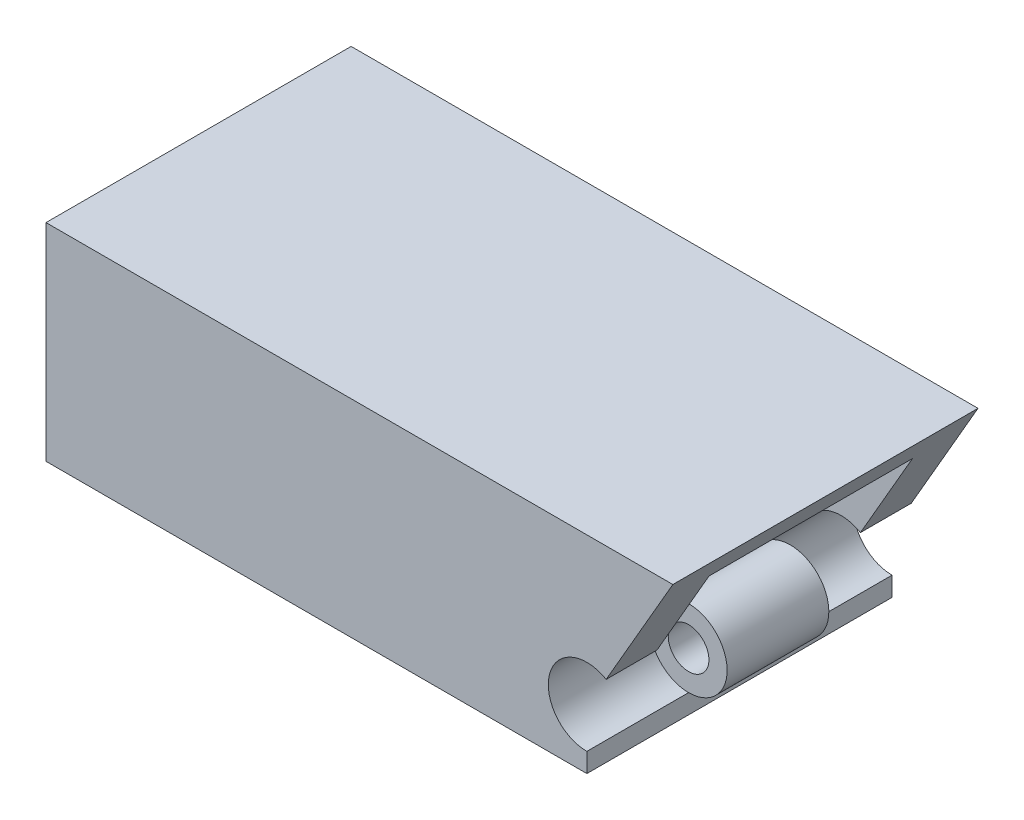
ISO-10303-21;
HEADER;
FILE_DESCRIPTION(('STEP AP214'),'2;1');
FILE_NAME('part.step','',(''),(''),'','','');
FILE_SCHEMA(('AUTOMOTIVE_DESIGN { 1 0 10303 214 1 1 1 1 }'));
ENDSEC;
DATA;
#1=APPLICATION_CONTEXT('core data for automotive mechanical design processes');
#2=APPLICATION_PROTOCOL_DEFINITION('international standard','automotive_design',2000,#1);
#3=PRODUCT_CONTEXT('',#1,'mechanical');
#4=PRODUCT('Part','Part','',(#3));
#5=PRODUCT_RELATED_PRODUCT_CATEGORY('part','',(#4));
#6=PRODUCT_DEFINITION_FORMATION('','',#4);
#7=PRODUCT_DEFINITION_CONTEXT('part definition',#1,'design');
#8=PRODUCT_DEFINITION('design','',#6,#7);
#9=PRODUCT_DEFINITION_SHAPE('','',#8);
#10=(LENGTH_UNIT() NAMED_UNIT(*) SI_UNIT(.MILLI.,.METRE.));
#11=(NAMED_UNIT(*) PLANE_ANGLE_UNIT() SI_UNIT($,.RADIAN.));
#12=(NAMED_UNIT(*) SI_UNIT($,.STERADIAN.) SOLID_ANGLE_UNIT());
#13=UNCERTAINTY_MEASURE_WITH_UNIT(LENGTH_MEASURE(1.E-05),#10,'distance_accuracy_value','');
#14=(GEOMETRIC_REPRESENTATION_CONTEXT(3) GLOBAL_UNCERTAINTY_ASSIGNED_CONTEXT((#13)) GLOBAL_UNIT_ASSIGNED_CONTEXT((#10,
#11,#12)) REPRESENTATION_CONTEXT('',''));
#15=CARTESIAN_POINT('',(0.,0.,0.));
#16=DIRECTION('',(0.,0.,1.));
#17=DIRECTION('',(1.,0.,0.));
#18=AXIS2_PLACEMENT_3D('',#15,#16,#17);
#19=CARTESIAN_POINT('',(24.3425770609215,-1.83534998850241,5.));
#20=DIRECTION('',(0.,-1.,0.));
#21=DIRECTION('',(1.,0.,0.));
#22=AXIS2_PLACEMENT_3D('',#19,#20,#21);
#23=PLANE('',#22);
#24=DIRECTION('',(0.,0.,-1.));
#25=VECTOR('',#24,1.);
#26=CARTESIAN_POINT('',(2.71205972214661,-1.83534998850242,5.));
#27=LINE('',#26,#25);
#28=CARTESIAN_POINT('',(2.71205972214662,-1.83534998850242,25.));
#29=VERTEX_POINT('',#28);
#30=CARTESIAN_POINT('',(2.71205972214661,-1.83534998850242,5.));
#31=VERTEX_POINT('',#30);
#32=EDGE_CURVE('E162',#29,#31,#27,.T.);
#33=ORIENTED_EDGE('',*,*,#32,.F.);
#34=DIRECTION('',(-1.,0.,0.));
#35=VECTOR('',#34,1.);
#36=CARTESIAN_POINT('',(24.3425770609215,-1.83534998850241,25.));
#37=LINE('',#36,#35);
#38=CARTESIAN_POINT('',(13.1721477464464,-1.83534998850241,25.));
#39=VERTEX_POINT('',#38);
#40=EDGE_CURVE('E233',#39,#29,#37,.T.);
#41=ORIENTED_EDGE('',*,*,#40,.F.);
#42=DIRECTION('',(0.,0.,1.));
#43=VECTOR('',#42,1.);
#44=CARTESIAN_POINT('',(13.1721477464464,-1.83534998850241,0.));
#45=LINE('',#44,#43);
#46=CARTESIAN_POINT('',(13.1721477464464,-1.83534998850241,20.));
#47=VERTEX_POINT('',#46);
#48=EDGE_CURVE('E11',#39,#47,#45,.F.);
#49=ORIENTED_EDGE('',*,*,#48,.T.);
#50=CARTESIAN_POINT('',(13.1721477464464,-1.83534998850241,10.));
#51=VERTEX_POINT('',#50);
#52=EDGE_CURVE('E50',#47,#51,#45,.F.);
#53=ORIENTED_EDGE('',*,*,#52,.T.);
#54=CARTESIAN_POINT('',(13.1721477464464,-1.83534998850241,5.));
#55=VERTEX_POINT('',#54);
#56=EDGE_CURVE('E51',#51,#55,#45,.F.);
#57=ORIENTED_EDGE('',*,*,#56,.T.);
#58=DIRECTION('',(-1.,0.,0.));
#59=VECTOR('',#58,1.);
#60=CARTESIAN_POINT('',(24.3425770609215,-1.83534998850241,5.));
#61=LINE('',#60,#59);
#62=EDGE_CURVE('E225',#55,#31,#61,.T.);
#63=ORIENTED_EDGE('',*,*,#62,.T.);
#64=EDGE_LOOP('',(#33,#41,#49,#53,#57,#63));
#65=FACE_BOUND('',#64,.T.);
#66=ADVANCED_FACE('F41',(#65),#23,.F.);
#67=CARTESIAN_POINT('',(15.8878766539393,-4.47932065616876,30.));
#68=DIRECTION('',(0.,0.,-1.));
#69=DIRECTION('',(-1.,0.,0.));
#70=AXIS2_PLACEMENT_3D('',#67,#68,#69);
#71=CYLINDRICAL_SURFACE('',#70,3.79021957021922);
#72=CARTESIAN_POINT('',(15.8878766539393,-4.47932065616876,10.));
#73=DIRECTION('',(0.,0.,-1.));
#74=DIRECTION('',(-1.,0.,0.));
#75=AXIS2_PLACEMENT_3D('',#72,#73,#74);
#76=CIRCLE('',#75,3.79021957021922);
#77=CARTESIAN_POINT('',(15.8878766539393,-8.26954022638798,10.));
#78=VERTEX_POINT('',#77);
#79=EDGE_CURVE('E186',#51,#78,#76,.T.);
#80=ORIENTED_EDGE('',*,*,#79,.F.);
#81=ORIENTED_EDGE('',*,*,#52,.F.);
#82=CARTESIAN_POINT('',(15.8878766539393,-4.47932065616876,20.));
#83=DIRECTION('',(0.,0.,1.));
#84=DIRECTION('',(1.,0.,0.));
#85=AXIS2_PLACEMENT_3D('',#82,#83,#84);
#86=CIRCLE('',#85,3.79021957021922);
#87=CARTESIAN_POINT('',(15.8878766539393,-8.26954022638798,20.));
#88=VERTEX_POINT('',#87);
#89=EDGE_CURVE('E205',#88,#47,#86,.T.);
#90=ORIENTED_EDGE('',*,*,#89,.F.);
#91=DIRECTION('',(0.,0.,-1.));
#92=VECTOR('',#91,1.);
#93=CARTESIAN_POINT('',(15.8878766539393,-8.26954022638797,30.));
#94=LINE('',#93,#92);
#95=EDGE_CURVE('E302',#88,#78,#94,.T.);
#96=ORIENTED_EDGE('',*,*,#95,.T.);
#97=EDGE_LOOP('',(#80,#81,#90,#96));
#98=FACE_BOUND('',#97,.T.);
#99=ADVANCED_FACE('F320',(#98),#71,.T.);
#100=CARTESIAN_POINT('',(15.8878766539393,-4.47932065616876,30.));
#101=DIRECTION('',(0.,0.,-1.));
#102=DIRECTION('',(-1.,0.,0.));
#103=AXIS2_PLACEMENT_3D('',#100,#101,#102);
#104=CYLINDRICAL_SURFACE('',#103,2.);
#105=CARTESIAN_POINT('',(15.8878766539393,-4.47932065616876,20.));
#106=DIRECTION('',(0.,0.,1.));
#107=DIRECTION('',(1.,0.,0.));
#108=AXIS2_PLACEMENT_3D('',#105,#106,#107);
#109=CIRCLE('',#108,2.);
#110=CARTESIAN_POINT('',(17.8878766539393,-4.47932065616876,20.));
#111=VERTEX_POINT('',#110);
#112=EDGE_CURVE('E197',#111,#111,#109,.T.);
#113=ORIENTED_EDGE('',*,*,#112,.T.);
#114=EDGE_LOOP('',(#113));
#115=FACE_BOUND('',#114,.T.);
#116=CARTESIAN_POINT('',(15.8878766539393,-4.47932065616876,10.));
#117=DIRECTION('',(0.,0.,-1.));
#118=DIRECTION('',(-1.,0.,0.));
#119=AXIS2_PLACEMENT_3D('',#116,#117,#118);
#120=CIRCLE('',#119,2.);
#121=CARTESIAN_POINT('',(13.8878766539393,-4.47932065616876,10.));
#122=VERTEX_POINT('',#121);
#123=EDGE_CURVE('E180',#122,#122,#120,.T.);
#124=ORIENTED_EDGE('',*,*,#123,.T.);
#125=EDGE_LOOP('',(#124));
#126=FACE_BOUND('',#125,.T.);
#127=ADVANCED_FACE('F367',(#115,#126),#104,.F.);
#128=CARTESIAN_POINT('',(0.,-10.1646500114976,30.));
#129=DIRECTION('',(0.,-1.,0.));
#130=DIRECTION('',(1.,0.,0.));
#131=AXIS2_PLACEMENT_3D('',#128,#129,#130);
#132=PLANE('',#131);
#133=DIRECTION('',(-1.,0.,0.));
#134=VECTOR('',#133,1.);
#135=CARTESIAN_POINT('',(2.71205972214661,-10.1646500114976,5.));
#136=LINE('',#135,#134);
#137=CARTESIAN_POINT('',(2.71205972214661,-10.1646500114976,5.));
#138=VERTEX_POINT('',#137);
#139=CARTESIAN_POINT('',(-37.2879402778534,-10.1646500114976,5.));
#140=VERTEX_POINT('',#139);
#141=EDGE_CURVE('E150',#138,#140,#136,.T.);
#142=ORIENTED_EDGE('',*,*,#141,.T.);
#143=DIRECTION('',(0.,0.,-1.));
#144=VECTOR('',#143,1.);
#145=CARTESIAN_POINT('',(-37.2879402778534,-10.1646500114976,30.));
#146=LINE('',#145,#144);
#147=CARTESIAN_POINT('',(-37.2879402778534,-10.1646500114976,0.));
#148=VERTEX_POINT('',#147);
#149=EDGE_CURVE('E269',#140,#148,#146,.T.);
#150=ORIENTED_EDGE('',*,*,#149,.T.);
#151=DIRECTION('',(-1.,0.,0.));
#152=VECTOR('',#151,1.);
#153=CARTESIAN_POINT('',(0.,-10.1646500114976,0.));
#154=LINE('',#153,#152);
#155=CARTESIAN_POINT('',(15.8878766539393,-10.1646500114976,0.));
#156=VERTEX_POINT('',#155);
#157=EDGE_CURVE('E249',#156,#148,#154,.T.);
#158=ORIENTED_EDGE('',*,*,#157,.F.);
#159=DIRECTION('',(0.,0.,-1.));
#160=VECTOR('',#159,1.);
#161=CARTESIAN_POINT('',(15.8878766539393,-10.1646500114976,30.));
#162=LINE('',#161,#160);
#163=CARTESIAN_POINT('',(15.8878766539393,-10.1646500114976,30.));
#164=VERTEX_POINT('',#163);
#165=EDGE_CURVE('E305',#164,#156,#162,.T.);
#166=ORIENTED_EDGE('',*,*,#165,.F.);
#167=DIRECTION('',(-1.,0.,0.));
#168=VECTOR('',#167,1.);
#169=CARTESIAN_POINT('',(0.,-10.1646500114976,30.));
#170=LINE('',#169,#168);
#171=CARTESIAN_POINT('',(-37.2879402778534,-10.1646500114976,30.));
#172=VERTEX_POINT('',#171);
#173=EDGE_CURVE('E250',#164,#172,#170,.T.);
#174=ORIENTED_EDGE('',*,*,#173,.T.);
#175=CARTESIAN_POINT('',(-37.2879402778534,-10.1646500114976,25.));
#176=VERTEX_POINT('',#175);
#177=EDGE_CURVE('E287',#172,#176,#146,.T.);
#178=ORIENTED_EDGE('',*,*,#177,.T.);
#179=DIRECTION('',(-1.,0.,0.));
#180=VECTOR('',#179,1.);
#181=CARTESIAN_POINT('',(2.71205972214661,-10.1646500114976,25.));
#182=LINE('',#181,#180);
#183=CARTESIAN_POINT('',(2.71205972214661,-10.1646500114976,25.));
#184=VERTEX_POINT('',#183);
#185=EDGE_CURVE('E161',#184,#176,#182,.T.);
#186=ORIENTED_EDGE('',*,*,#185,.F.);
#187=DIRECTION('',(0.,0.,1.));
#188=VECTOR('',#187,1.);
#189=CARTESIAN_POINT('',(2.71205972214661,-10.1646500114976,5.));
#190=LINE('',#189,#188);
#191=EDGE_CURVE('E165',#138,#184,#190,.T.);
#192=ORIENTED_EDGE('',*,*,#191,.F.);
#193=EDGE_LOOP('',(#142,#150,#158,#166,#174,#178,#186,#192));
#194=FACE_BOUND('',#193,.T.);
#195=ADVANCED_FACE('F43',(#194),#132,.T.);
#196=CARTESIAN_POINT('',(15.8878766539393,0.,30.));
#197=DIRECTION('',(-1.,0.,0.));
#198=DIRECTION('',(0.,0.,1.));
#199=AXIS2_PLACEMENT_3D('',#196,#197,#198);
#200=PLANE('',#199);
#201=DIRECTION('',(0.,1.,0.));
#202=VECTOR('',#201,1.);
#203=CARTESIAN_POINT('',(15.8878766539393,0.,0.));
#204=LINE('',#203,#202);
#205=CARTESIAN_POINT('',(15.8878766539393,-8.26954022638798,0.));
#206=VERTEX_POINT('',#205);
#207=EDGE_CURVE('E273',#156,#206,#204,.T.);
#208=ORIENTED_EDGE('',*,*,#207,.T.);
#209=DIRECTION('',(0.,0.,-1.));
#210=VECTOR('',#209,1.);
#211=CARTESIAN_POINT('',(15.8878766539393,-8.26954022638798,10.));
#212=LINE('',#211,#210);
#213=EDGE_CURVE('E190',#206,#78,#212,.F.);
#214=ORIENTED_EDGE('',*,*,#213,.T.);
#215=ORIENTED_EDGE('',*,*,#95,.F.);
#216=CARTESIAN_POINT('',(15.8878766539393,-8.26954022638798,30.));
#217=VERTEX_POINT('',#216);
#218=EDGE_CURVE('E303',#217,#88,#94,.T.);
#219=ORIENTED_EDGE('',*,*,#218,.F.);
#220=DIRECTION('',(0.,1.,0.));
#221=VECTOR('',#220,1.);
#222=CARTESIAN_POINT('',(15.8878766539393,0.,30.));
#223=LINE('',#222,#221);
#224=EDGE_CURVE('E254',#164,#217,#223,.T.);
#225=ORIENTED_EDGE('',*,*,#224,.F.);
#226=ORIENTED_EDGE('',*,*,#165,.T.);
#227=EDGE_LOOP('',(#208,#214,#215,#219,#225,#226));
#228=FACE_BOUND('',#227,.T.);
#229=ADVANCED_FACE('F326',(#228),#200,.F.);
#230=CARTESIAN_POINT('',(13.8555102304238,-7.99948256129477,30.));
#231=DIRECTION('',(0.866025403784439,-0.5,0.));
#232=DIRECTION('',(0.5,0.866025403784439,0.));
#233=AXIS2_PLACEMENT_3D('',#230,#231,#232);
#234=PLANE('',#233);
#235=DIRECTION('',(0.5,0.866025403784439,0.));
#236=VECTOR('',#235,1.);
#237=CARTESIAN_POINT('',(13.8555102304238,-7.99948256129478,5.));
#238=LINE('',#237,#236);
#239=CARTESIAN_POINT('',(17.7829864390489,-1.19689422243799,5.));
#240=VERTEX_POINT('',#239);
#241=CARTESIAN_POINT('',(22.8992013879474,7.66465001149759,5.));
#242=VERTEX_POINT('',#241);
#243=EDGE_CURVE('E246',#240,#242,#238,.T.);
#244=ORIENTED_EDGE('',*,*,#243,.F.);
#245=DIRECTION('',(0.,0.,-1.));
#246=VECTOR('',#245,1.);
#247=CARTESIAN_POINT('',(17.7829864390489,-1.196894222438,30.));
#248=LINE('',#247,#246);
#249=CARTESIAN_POINT('',(17.7829864390489,-1.19689422243799,0.));
#250=VERTEX_POINT('',#249);
#251=EDGE_CURVE('E297',#240,#250,#248,.T.);
#252=ORIENTED_EDGE('',*,*,#251,.T.);
#253=DIRECTION('',(-0.5,-0.866025403784439,0.));
#254=VECTOR('',#253,1.);
#255=CARTESIAN_POINT('',(13.8555102304238,-7.99948256129477,0.));
#256=LINE('',#255,#254);
#257=CARTESIAN_POINT('',(24.3425770609215,10.1646500114976,0.));
#258=VERTEX_POINT('',#257);
#259=EDGE_CURVE('E277',#258,#250,#256,.T.);
#260=ORIENTED_EDGE('',*,*,#259,.F.);
#261=DIRECTION('',(0.,0.,-1.));
#262=VECTOR('',#261,1.);
#263=CARTESIAN_POINT('',(24.3425770609215,10.1646500114976,30.));
#264=LINE('',#263,#262);
#265=CARTESIAN_POINT('',(24.3425770609215,10.1646500114976,30.));
#266=VERTEX_POINT('',#265);
#267=EDGE_CURVE('E294',#266,#258,#264,.T.);
#268=ORIENTED_EDGE('',*,*,#267,.F.);
#269=DIRECTION('',(-0.5,-0.866025403784439,0.));
#270=VECTOR('',#269,1.);
#271=CARTESIAN_POINT('',(13.8555102304238,-7.99948256129477,30.));
#272=LINE('',#271,#270);
#273=CARTESIAN_POINT('',(17.7829864390489,-1.19689422243799,30.));
#274=VERTEX_POINT('',#273);
#275=EDGE_CURVE('E259',#266,#274,#272,.T.);
#276=ORIENTED_EDGE('',*,*,#275,.T.);
#277=CARTESIAN_POINT('',(17.7829864390489,-1.196894222438,25.));
#278=VERTEX_POINT('',#277);
#279=EDGE_CURVE('E298',#274,#278,#248,.T.);
#280=ORIENTED_EDGE('',*,*,#279,.T.);
#281=DIRECTION('',(-0.5,-0.866025403784439,0.));
#282=VECTOR('',#281,1.);
#283=CARTESIAN_POINT('',(13.8555102304238,-7.99948256129478,25.));
#284=LINE('',#283,#282);
#285=CARTESIAN_POINT('',(22.8992013879474,7.66465001149759,25.));
#286=VERTEX_POINT('',#285);
#287=EDGE_CURVE('E229',#286,#278,#284,.T.);
#288=ORIENTED_EDGE('',*,*,#287,.F.);
#289=DIRECTION('',(0.,0.,1.));
#290=VECTOR('',#289,1.);
#291=CARTESIAN_POINT('',(22.8992013879474,7.66465001149759,30.));
#292=LINE('',#291,#290);
#293=EDGE_CURVE('E242',#242,#286,#292,.T.);
#294=ORIENTED_EDGE('',*,*,#293,.F.);
#295=EDGE_LOOP('',(#244,#252,#260,#268,#276,#280,#288,#294));
#296=FACE_BOUND('',#295,.T.);
#297=ADVANCED_FACE('F340',(#296),#234,.T.);
#298=CARTESIAN_POINT('',(0.,10.1646500114976,30.));
#299=DIRECTION('',(0.,-1.,0.));
#300=DIRECTION('',(1.,0.,0.));
#301=AXIS2_PLACEMENT_3D('',#298,#299,#300);
#302=PLANE('',#301);
#303=DIRECTION('',(-1.,0.,0.));
#304=VECTOR('',#303,1.);
#305=CARTESIAN_POINT('',(0.,10.1646500114976,0.));
#306=LINE('',#305,#304);
#307=CARTESIAN_POINT('',(-37.2879402778534,10.1646500114976,0.));
#308=VERTEX_POINT('',#307);
#309=EDGE_CURVE('E281',#258,#308,#306,.T.);
#310=ORIENTED_EDGE('',*,*,#309,.T.);
#311=DIRECTION('',(0.,0.,-1.));
#312=VECTOR('',#311,1.);
#313=CARTESIAN_POINT('',(-37.2879402778534,10.1646500114976,30.));
#314=LINE('',#313,#312);
#315=CARTESIAN_POINT('',(-37.2879402778534,10.1646500114976,30.));
#316=VERTEX_POINT('',#315);
#317=EDGE_CURVE('E290',#316,#308,#314,.T.);
#318=ORIENTED_EDGE('',*,*,#317,.F.);
#319=DIRECTION('',(-1.,0.,0.));
#320=VECTOR('',#319,1.);
#321=CARTESIAN_POINT('',(0.,10.1646500114976,30.));
#322=LINE('',#321,#320);
#323=EDGE_CURVE('E263',#266,#316,#322,.T.);
#324=ORIENTED_EDGE('',*,*,#323,.F.);
#325=ORIENTED_EDGE('',*,*,#267,.T.);
#326=EDGE_LOOP('',(#310,#318,#324,#325));
#327=FACE_BOUND('',#326,.T.);
#328=ADVANCED_FACE('F387',(#327),#302,.F.);
#329=CARTESIAN_POINT('',(-37.2879402778534,0.,30.));
#330=DIRECTION('',(1.,0.,0.));
#331=DIRECTION('',(0.,1.,0.));
#332=AXIS2_PLACEMENT_3D('',#329,#330,#331);
#333=PLANE('',#332);
#334=ORIENTED_EDGE('',*,*,#149,.F.);
#335=DIRECTION('',(0.,-1.,0.));
#336=VECTOR('',#335,1.);
#337=CARTESIAN_POINT('',(-37.2879402778534,7.66465001149757,5.));
#338=LINE('',#337,#336);
#339=CARTESIAN_POINT('',(-37.2879402778534,7.66465001149757,5.));
#340=VERTEX_POINT('',#339);
#341=EDGE_CURVE('E156',#340,#140,#338,.T.);
#342=ORIENTED_EDGE('',*,*,#341,.F.);
#343=DIRECTION('',(0.,0.,-1.));
#344=VECTOR('',#343,1.);
#345=CARTESIAN_POINT('',(-37.2879402778534,7.66465001149757,5.));
#346=LINE('',#345,#344);
#347=CARTESIAN_POINT('',(-37.2879402778534,7.66465001149757,25.));
#348=VERTEX_POINT('',#347);
#349=EDGE_CURVE('E221',#348,#340,#346,.T.);
#350=ORIENTED_EDGE('',*,*,#349,.F.);
#351=DIRECTION('',(0.,1.,0.));
#352=VECTOR('',#351,1.);
#353=CARTESIAN_POINT('',(-37.2879402778534,7.66465001149757,25.));
#354=LINE('',#353,#352);
#355=EDGE_CURVE('E217',#176,#348,#354,.T.);
#356=ORIENTED_EDGE('',*,*,#355,.F.);
#357=ORIENTED_EDGE('',*,*,#177,.F.);
#358=DIRECTION('',(0.,-1.,0.));
#359=VECTOR('',#358,1.);
#360=CARTESIAN_POINT('',(-37.2879402778534,0.,30.));
#361=LINE('',#360,#359);
#362=EDGE_CURVE('E266',#316,#172,#361,.T.);
#363=ORIENTED_EDGE('',*,*,#362,.F.);
#364=ORIENTED_EDGE('',*,*,#317,.T.);
#365=DIRECTION('',(0.,-1.,0.));
#366=VECTOR('',#365,1.);
#367=CARTESIAN_POINT('',(-37.2879402778534,0.,0.));
#368=LINE('',#367,#366);
#369=EDGE_CURVE('E255',#308,#148,#368,.T.);
#370=ORIENTED_EDGE('',*,*,#369,.T.);
#371=EDGE_LOOP('',(#334,#342,#350,#356,#357,#363,#364,#370));
#372=FACE_BOUND('',#371,.T.);
#373=ADVANCED_FACE('F378',(#372),#333,.F.);
#374=CARTESIAN_POINT('',(0.,0.,30.));
#375=DIRECTION('',(0.,0.,1.));
#376=DIRECTION('',(1.,0.,0.));
#377=AXIS2_PLACEMENT_3D('',#374,#375,#376);
#378=PLANE('',#377);
#379=CARTESIAN_POINT('',(15.8878766539393,-4.47932065616876,30.));
#380=DIRECTION('',(0.,0.,1.));
#381=DIRECTION('',(1.,0.,0.));
#382=AXIS2_PLACEMENT_3D('',#379,#380,#381);
#383=CIRCLE('',#382,3.79021957021922);
#384=EDGE_CURVE('E201',#274,#217,#383,.T.);
#385=ORIENTED_EDGE('',*,*,#384,.F.);
#386=ORIENTED_EDGE('',*,*,#275,.F.);
#387=ORIENTED_EDGE('',*,*,#323,.T.);
#388=ORIENTED_EDGE('',*,*,#362,.T.);
#389=ORIENTED_EDGE('',*,*,#173,.F.);
#390=ORIENTED_EDGE('',*,*,#224,.T.);
#391=EDGE_LOOP('',(#385,#386,#387,#388,#389,#390));
#392=FACE_BOUND('',#391,.T.);
#393=ADVANCED_FACE('F375',(#392),#378,.T.);
#394=CARTESIAN_POINT('',(0.,0.,0.));
#395=DIRECTION('',(0.,0.,1.));
#396=DIRECTION('',(1.,0.,0.));
#397=AXIS2_PLACEMENT_3D('',#394,#395,#396);
#398=PLANE('',#397);
#399=ORIENTED_EDGE('',*,*,#259,.T.);
#400=CARTESIAN_POINT('',(15.8878766539393,-4.47932065616876,0.));
#401=DIRECTION('',(0.,0.,-1.));
#402=DIRECTION('',(-1.,0.,0.));
#403=AXIS2_PLACEMENT_3D('',#400,#401,#402);
#404=CIRCLE('',#403,3.79021957021922);
#405=EDGE_CURVE('E185',#206,#250,#404,.T.);
#406=ORIENTED_EDGE('',*,*,#405,.F.);
#407=ORIENTED_EDGE('',*,*,#207,.F.);
#408=ORIENTED_EDGE('',*,*,#157,.T.);
#409=ORIENTED_EDGE('',*,*,#369,.F.);
#410=ORIENTED_EDGE('',*,*,#309,.F.);
#411=EDGE_LOOP('',(#399,#406,#407,#408,#409,#410));
#412=FACE_BOUND('',#411,.T.);
#413=ADVANCED_FACE('F333',(#412),#398,.F.);
#414=CARTESIAN_POINT('',(24.3425770609215,7.66465001149759,5.));
#415=DIRECTION('',(0.,0.,-1.));
#416=DIRECTION('',(0.,1.,0.));
#417=AXIS2_PLACEMENT_3D('',#414,#415,#416);
#418=PLANE('',#417);
#419=ORIENTED_EDGE('',*,*,#62,.F.);
#420=CARTESIAN_POINT('',(15.8878766539393,-4.47932065616876,5.));
#421=DIRECTION('',(0.,0.,-1.));
#422=DIRECTION('',(0.,1.,0.));
#423=AXIS2_PLACEMENT_3D('',#420,#421,#422);
#424=CIRCLE('',#423,3.79021957021922);
#425=EDGE_CURVE('E211',#55,#240,#424,.T.);
#426=ORIENTED_EDGE('',*,*,#425,.T.);
#427=ORIENTED_EDGE('',*,*,#243,.T.);
#428=DIRECTION('',(-1.,0.,0.));
#429=VECTOR('',#428,1.);
#430=CARTESIAN_POINT('',(24.3425770609215,7.66465001149759,5.));
#431=LINE('',#430,#429);
#432=EDGE_CURVE('E226',#242,#340,#431,.T.);
#433=ORIENTED_EDGE('',*,*,#432,.T.);
#434=ORIENTED_EDGE('',*,*,#341,.T.);
#435=ORIENTED_EDGE('',*,*,#141,.F.);
#436=DIRECTION('',(0.,-1.,0.));
#437=VECTOR('',#436,1.);
#438=CARTESIAN_POINT('',(2.71205972214661,-1.83534998850242,5.));
#439=LINE('',#438,#437);
#440=EDGE_CURVE('E154',#31,#138,#439,.T.);
#441=ORIENTED_EDGE('',*,*,#440,.F.);
#442=EDGE_LOOP('',(#419,#426,#427,#433,#434,#435,#441));
#443=FACE_BOUND('',#442,.T.);
#444=ADVANCED_FACE('F153',(#443),#418,.F.);
#445=CARTESIAN_POINT('',(24.3425770609215,7.66465001149759,25.));
#446=DIRECTION('',(0.,0.,1.));
#447=DIRECTION('',(0.,-1.,0.));
#448=AXIS2_PLACEMENT_3D('',#445,#446,#447);
#449=PLANE('',#448);
#450=ORIENTED_EDGE('',*,*,#287,.T.);
#451=CARTESIAN_POINT('',(15.8878766539393,-4.47932065616876,25.));
#452=DIRECTION('',(0.,0.,1.));
#453=DIRECTION('',(0.,-1.,0.));
#454=AXIS2_PLACEMENT_3D('',#451,#452,#453);
#455=CIRCLE('',#454,3.79021957021922);
#456=EDGE_CURVE('E204',#278,#39,#455,.T.);
#457=ORIENTED_EDGE('',*,*,#456,.T.);
#458=ORIENTED_EDGE('',*,*,#40,.T.);
#459=DIRECTION('',(0.,1.,0.));
#460=VECTOR('',#459,1.);
#461=CARTESIAN_POINT('',(2.71205972214661,-1.83534998850242,25.));
#462=LINE('',#461,#460);
#463=EDGE_CURVE('E58',#184,#29,#462,.T.);
#464=ORIENTED_EDGE('',*,*,#463,.F.);
#465=ORIENTED_EDGE('',*,*,#185,.T.);
#466=ORIENTED_EDGE('',*,*,#355,.T.);
#467=DIRECTION('',(-1.,0.,0.));
#468=VECTOR('',#467,1.);
#469=CARTESIAN_POINT('',(24.3425770609215,7.66465001149759,25.));
#470=LINE('',#469,#468);
#471=EDGE_CURVE('E230',#286,#348,#470,.T.);
#472=ORIENTED_EDGE('',*,*,#471,.F.);
#473=EDGE_LOOP('',(#450,#457,#458,#464,#465,#466,#472));
#474=FACE_BOUND('',#473,.T.);
#475=ADVANCED_FACE('F371',(#474),#449,.F.);
#476=CARTESIAN_POINT('',(24.3425770609215,7.66465001149759,5.));
#477=DIRECTION('',(0.,1.,0.));
#478=DIRECTION('',(-1.,0.,0.));
#479=AXIS2_PLACEMENT_3D('',#476,#477,#478);
#480=PLANE('',#479);
#481=ORIENTED_EDGE('',*,*,#293,.T.);
#482=ORIENTED_EDGE('',*,*,#471,.T.);
#483=ORIENTED_EDGE('',*,*,#349,.T.);
#484=ORIENTED_EDGE('',*,*,#432,.F.);
#485=EDGE_LOOP('',(#481,#482,#483,#484));
#486=FACE_BOUND('',#485,.T.);
#487=ADVANCED_FACE('F359',(#486),#480,.F.);
#488=CARTESIAN_POINT('',(15.8878766539393,-4.47932065616876,20.));
#489=DIRECTION('',(0.,0.,1.));
#490=DIRECTION('',(1.,0.,0.));
#491=AXIS2_PLACEMENT_3D('',#488,#489,#490);
#492=CYLINDRICAL_SURFACE('',#491,3.79021957021922);
#493=EDGE_CURVE('E66',#47,#88,#86,.T.);
#494=ORIENTED_EDGE('',*,*,#493,.F.);
#495=ORIENTED_EDGE('',*,*,#48,.F.);
#496=ORIENTED_EDGE('',*,*,#456,.F.);
#497=ORIENTED_EDGE('',*,*,#279,.F.);
#498=ORIENTED_EDGE('',*,*,#384,.T.);
#499=ORIENTED_EDGE('',*,*,#218,.T.);
#500=EDGE_LOOP('',(#494,#495,#496,#497,#498,#499));
#501=FACE_BOUND('',#500,.T.);
#502=ADVANCED_FACE('F351',(#501),#492,.F.);
#503=CARTESIAN_POINT('',(15.8878766539393,-4.47932065616876,20.));
#504=DIRECTION('',(0.,0.,1.));
#505=DIRECTION('',(1.,0.,0.));
#506=AXIS2_PLACEMENT_3D('',#503,#504,#505);
#507=PLANE('',#506);
#508=ORIENTED_EDGE('',*,*,#112,.F.);
#509=EDGE_LOOP('',(#508));
#510=FACE_BOUND('',#509,.T.);
#511=ORIENTED_EDGE('',*,*,#493,.T.);
#512=ORIENTED_EDGE('',*,*,#89,.T.);
#513=EDGE_LOOP('',(#511,#512));
#514=FACE_BOUND('',#513,.T.);
#515=ADVANCED_FACE('F349',(#510,#514),#507,.T.);
#516=CARTESIAN_POINT('',(15.8878766539393,-4.47932065616876,10.));
#517=DIRECTION('',(0.,0.,-1.));
#518=DIRECTION('',(-1.,0.,0.));
#519=AXIS2_PLACEMENT_3D('',#516,#517,#518);
#520=CYLINDRICAL_SURFACE('',#519,3.79021957021922);
#521=ORIENTED_EDGE('',*,*,#405,.T.);
#522=ORIENTED_EDGE('',*,*,#251,.F.);
#523=ORIENTED_EDGE('',*,*,#425,.F.);
#524=ORIENTED_EDGE('',*,*,#56,.F.);
#525=EDGE_CURVE('E191',#78,#51,#76,.T.);
#526=ORIENTED_EDGE('',*,*,#525,.F.);
#527=ORIENTED_EDGE('',*,*,#213,.F.);
#528=EDGE_LOOP('',(#521,#522,#523,#524,#526,#527));
#529=FACE_BOUND('',#528,.T.);
#530=ADVANCED_FACE('F330',(#529),#520,.F.);
#531=CARTESIAN_POINT('',(15.8878766539393,-4.47932065616876,10.));
#532=DIRECTION('',(0.,0.,-1.));
#533=DIRECTION('',(-1.,0.,0.));
#534=AXIS2_PLACEMENT_3D('',#531,#532,#533);
#535=PLANE('',#534);
#536=ORIENTED_EDGE('',*,*,#123,.F.);
#537=EDGE_LOOP('',(#536));
#538=FACE_BOUND('',#537,.T.);
#539=ORIENTED_EDGE('',*,*,#79,.T.);
#540=ORIENTED_EDGE('',*,*,#525,.T.);
#541=EDGE_LOOP('',(#539,#540));
#542=FACE_BOUND('',#541,.T.);
#543=ADVANCED_FACE('F325',(#538,#542),#535,.T.);
#544=CARTESIAN_POINT('',(2.71205972214661,0.,0.));
#545=DIRECTION('',(-1.,0.,0.));
#546=DIRECTION('',(0.,0.,1.));
#547=AXIS2_PLACEMENT_3D('',#544,#545,#546);
#548=PLANE('',#547);
#549=ORIENTED_EDGE('',*,*,#440,.T.);
#550=ORIENTED_EDGE('',*,*,#191,.T.);
#551=ORIENTED_EDGE('',*,*,#463,.T.);
#552=ORIENTED_EDGE('',*,*,#32,.T.);
#553=EDGE_LOOP('',(#549,#550,#551,#552));
#554=FACE_BOUND('',#553,.T.);
#555=ADVANCED_FACE('F164',(#554),#548,.T.);
#556=CLOSED_SHELL('',(#66,#99,#127,#195,#229,#297,#328,#373,#393,#413,#444,#475,#487,#502,#515,
#530,#543,#555));
#557=MANIFOLD_SOLID_BREP('B2',#556);
#558=ADVANCED_BREP_SHAPE_REPRESENTATION('',(#18,#557),#14);
#559=SHAPE_DEFINITION_REPRESENTATION(#9,#558);
ENDSEC;
END-ISO-10303-21;
